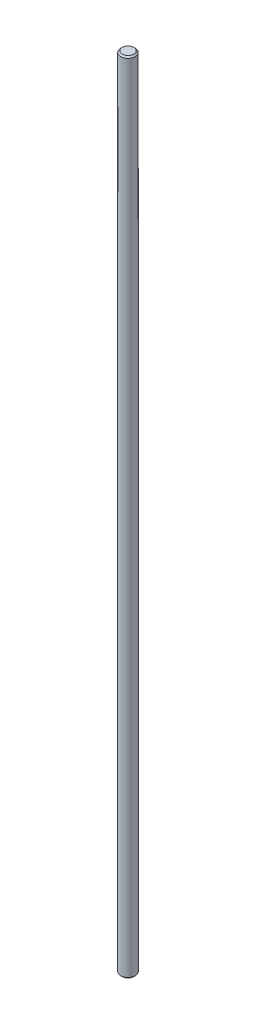
ISO-10303-21;
HEADER;
FILE_DESCRIPTION(('STEP AP214'),'2;1');
FILE_NAME('part.step','',(''),(''),'','','');
FILE_SCHEMA(('AUTOMOTIVE_DESIGN { 1 0 10303 214 1 1 1 1 }'));
ENDSEC;
DATA;
#1=APPLICATION_CONTEXT('core data for automotive mechanical design processes');
#2=APPLICATION_PROTOCOL_DEFINITION('international standard','automotive_design',2000,#1);
#3=PRODUCT_CONTEXT('',#1,'mechanical');
#4=PRODUCT('Part','Part','',(#3));
#5=PRODUCT_RELATED_PRODUCT_CATEGORY('part','',(#4));
#6=PRODUCT_DEFINITION_FORMATION('','',#4);
#7=PRODUCT_DEFINITION_CONTEXT('part definition',#1,'design');
#8=PRODUCT_DEFINITION('design','',#6,#7);
#9=PRODUCT_DEFINITION_SHAPE('','',#8);
#10=(LENGTH_UNIT() NAMED_UNIT(*) SI_UNIT(.MILLI.,.METRE.));
#11=(NAMED_UNIT(*) PLANE_ANGLE_UNIT() SI_UNIT($,.RADIAN.));
#12=(NAMED_UNIT(*) SI_UNIT($,.STERADIAN.) SOLID_ANGLE_UNIT());
#13=UNCERTAINTY_MEASURE_WITH_UNIT(LENGTH_MEASURE(1.E-05),#10,'distance_accuracy_value','');
#14=(GEOMETRIC_REPRESENTATION_CONTEXT(3) GLOBAL_UNCERTAINTY_ASSIGNED_CONTEXT((#13)) GLOBAL_UNIT_ASSIGNED_CONTEXT((#10,
#11,#12)) REPRESENTATION_CONTEXT('',''));
#15=CARTESIAN_POINT('',(0.,0.,0.));
#16=DIRECTION('',(0.,0.,1.));
#17=DIRECTION('',(1.,0.,0.));
#18=AXIS2_PLACEMENT_3D('',#15,#16,#17);
#19=CARTESIAN_POINT('',(2.,0.,0.));
#20=DIRECTION('',(0.,1.,0.));
#21=DIRECTION('',(0.,0.,1.));
#22=AXIS2_PLACEMENT_3D('',#19,#20,#21);
#23=PLANE('',#22);
#24=CARTESIAN_POINT('',(0.,5.6843418860808E-11,0.));
#25=DIRECTION('',(0.,-1.,0.));
#26=DIRECTION('',(0.,0.,-1.));
#27=AXIS2_PLACEMENT_3D('',#24,#25,#26);
#28=CIRCLE('',#27,3.99999999996226);
#29=CARTESIAN_POINT('',(0.,5.6843418860808E-11,-3.99999999996226));
#30=VERTEX_POINT('',#29);
#31=EDGE_CURVE('E17',#30,#30,#28,.T.);
#32=ORIENTED_EDGE('',*,*,#31,.F.);
#33=EDGE_LOOP('',(#32));
#34=FACE_BOUND('',#33,.T.);
#35=ADVANCED_FACE('F14',(#34),#23,.T.);
#36=CARTESIAN_POINT('',(2.,-550.,0.));
#37=DIRECTION('',(0.,-1.,0.));
#38=DIRECTION('',(0.,0.,-1.));
#39=AXIS2_PLACEMENT_3D('',#36,#37,#38);
#40=PLANE('',#39);
#41=CARTESIAN_POINT('',(0.,-550.000000000011,0.));
#42=DIRECTION('',(0.,1.,0.));
#43=DIRECTION('',(0.,0.,1.));
#44=AXIS2_PLACEMENT_3D('',#41,#42,#43);
#45=CIRCLE('',#44,3.99999999996226);
#46=CARTESIAN_POINT('',(0.,-550.000000000011,3.99999999996226));
#47=VERTEX_POINT('',#46);
#48=EDGE_CURVE('E26',#47,#47,#45,.T.);
#49=ORIENTED_EDGE('',*,*,#48,.F.);
#50=EDGE_LOOP('',(#49));
#51=FACE_BOUND('',#50,.T.);
#52=ADVANCED_FACE('F38',(#51),#40,.T.);
#53=CARTESIAN_POINT('',(0.,-0.999999999976353,0.));
#54=DIRECTION('',(0.,-1.,0.));
#55=DIRECTION('',(0.,0.,-1.));
#56=AXIS2_PLACEMENT_3D('',#53,#54,#55);
#57=CONICAL_SURFACE('',#56,4.99999999999545,0.785398163397448);
#58=ORIENTED_EDGE('',*,*,#31,.T.);
#59=EDGE_LOOP('',(#58));
#60=FACE_BOUND('',#59,.T.);
#61=CARTESIAN_POINT('',(0.,-1.,0.));
#62=DIRECTION('',(0.,1.,0.));
#63=DIRECTION('',(0.,0.,1.));
#64=AXIS2_PLACEMENT_3D('',#61,#62,#63);
#65=CIRCLE('',#64,5.);
#66=CARTESIAN_POINT('',(0.,-1.,5.));
#67=VERTEX_POINT('',#66);
#68=EDGE_CURVE('E21',#67,#67,#65,.F.);
#69=ORIENTED_EDGE('',*,*,#68,.F.);
#70=EDGE_LOOP('',(#69));
#71=FACE_BOUND('',#70,.T.);
#72=ADVANCED_FACE('F34',(#60,#71),#57,.T.);
#73=CARTESIAN_POINT('',(0.,-549.000000000035,0.));
#74=DIRECTION('',(0.,1.,0.));
#75=DIRECTION('',(0.,0.,1.));
#76=AXIS2_PLACEMENT_3D('',#73,#74,#75);
#77=CONICAL_SURFACE('',#76,4.99999999999545,0.78539816342587);
#78=ORIENTED_EDGE('',*,*,#48,.T.);
#79=EDGE_LOOP('',(#78));
#80=FACE_BOUND('',#79,.T.);
#81=CARTESIAN_POINT('',(0.,-549.,0.));
#82=DIRECTION('',(0.,1.,0.));
#83=DIRECTION('',(0.,0.,1.));
#84=AXIS2_PLACEMENT_3D('',#81,#82,#83);
#85=CIRCLE('',#84,5.);
#86=CARTESIAN_POINT('',(0.,-549.,5.));
#87=VERTEX_POINT('',#86);
#88=EDGE_CURVE('E9',#87,#87,#85,.T.);
#89=ORIENTED_EDGE('',*,*,#88,.F.);
#90=EDGE_LOOP('',(#89));
#91=FACE_BOUND('',#90,.T.);
#92=ADVANCED_FACE('F46',(#80,#91),#77,.T.);
#93=CARTESIAN_POINT('',(0.,-275.,0.));
#94=DIRECTION('',(0.,1.,0.));
#95=DIRECTION('',(0.,0.,1.));
#96=AXIS2_PLACEMENT_3D('',#93,#94,#95);
#97=CYLINDRICAL_SURFACE('',#96,5.);
#98=ORIENTED_EDGE('',*,*,#68,.T.);
#99=EDGE_LOOP('',(#98));
#100=FACE_BOUND('',#99,.T.);
#101=ORIENTED_EDGE('',*,*,#88,.T.);
#102=EDGE_LOOP('',(#101));
#103=FACE_BOUND('',#102,.T.);
#104=ADVANCED_FACE('F44',(#100,#103),#97,.T.);
#105=CLOSED_SHELL('',(#35,#52,#72,#92,#104));
#106=MANIFOLD_SOLID_BREP('B1',#105);
#107=ADVANCED_BREP_SHAPE_REPRESENTATION('',(#18,#106),#14);
#108=SHAPE_DEFINITION_REPRESENTATION(#9,#107);
ENDSEC;
END-ISO-10303-21;
